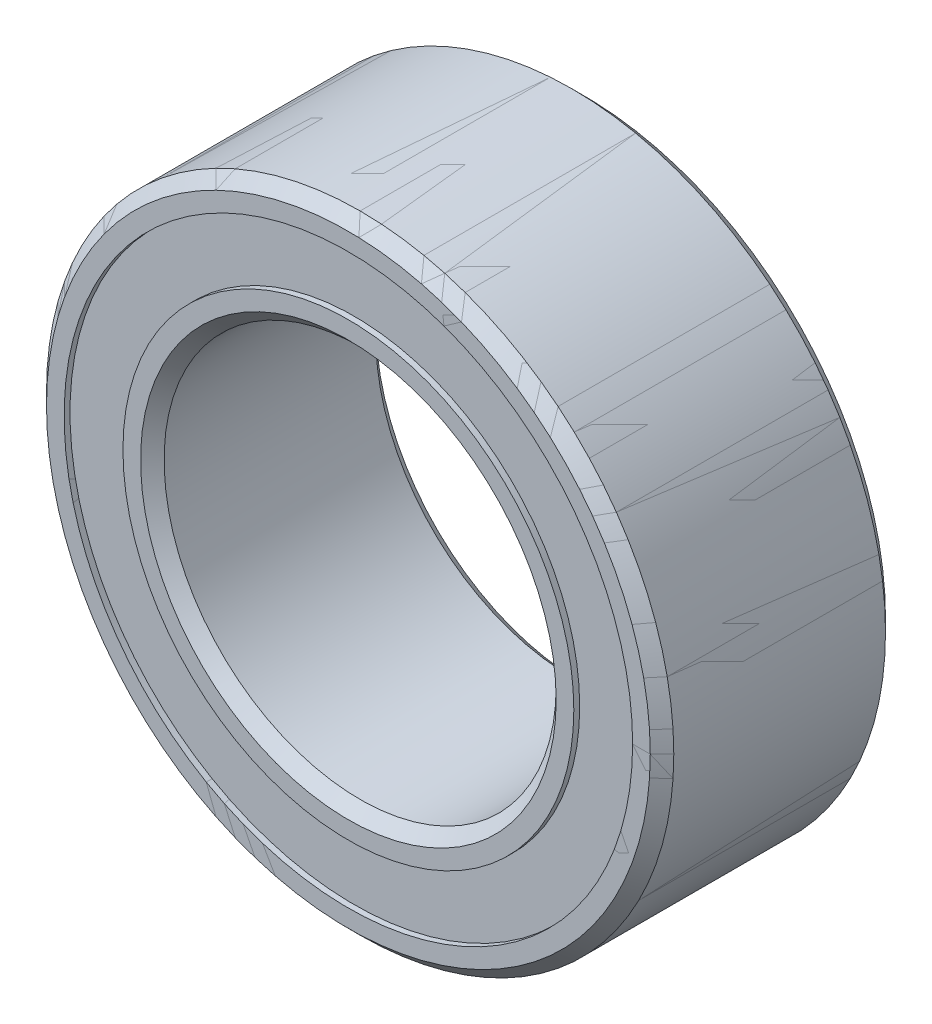
ISO-10303-21;
HEADER;
FILE_DESCRIPTION(('STEP AP214'),'2;1');
FILE_NAME('part.step','',(''),(''),'','','');
FILE_SCHEMA(('AUTOMOTIVE_DESIGN { 1 0 10303 214 1 1 1 1 }'));
ENDSEC;
DATA;
#1=APPLICATION_CONTEXT('core data for automotive mechanical design processes');
#2=APPLICATION_PROTOCOL_DEFINITION('international standard','automotive_design',2000,#1);
#3=PRODUCT_CONTEXT('',#1,'mechanical');
#4=PRODUCT('Part','Part','',(#3));
#5=PRODUCT_RELATED_PRODUCT_CATEGORY('part','',(#4));
#6=PRODUCT_DEFINITION_FORMATION('','',#4);
#7=PRODUCT_DEFINITION_CONTEXT('part definition',#1,'design');
#8=PRODUCT_DEFINITION('design','',#6,#7);
#9=PRODUCT_DEFINITION_SHAPE('','',#8);
#10=(LENGTH_UNIT() NAMED_UNIT(*) SI_UNIT(.MILLI.,.METRE.));
#11=(NAMED_UNIT(*) PLANE_ANGLE_UNIT() SI_UNIT($,.RADIAN.));
#12=(NAMED_UNIT(*) SI_UNIT($,.STERADIAN.) SOLID_ANGLE_UNIT());
#13=UNCERTAINTY_MEASURE_WITH_UNIT(LENGTH_MEASURE(1.E-05),#10,'distance_accuracy_value','');
#14=(GEOMETRIC_REPRESENTATION_CONTEXT(3) GLOBAL_UNCERTAINTY_ASSIGNED_CONTEXT((#13)) GLOBAL_UNIT_ASSIGNED_CONTEXT((#10,
#11,#12)) REPRESENTATION_CONTEXT('',''));
#15=CARTESIAN_POINT('',(0.,0.,0.));
#16=DIRECTION('',(0.,0.,1.));
#17=DIRECTION('',(1.,0.,0.));
#18=AXIS2_PLACEMENT_3D('',#15,#16,#17);
#19=CARTESIAN_POINT('',(0.,0.,1.5));
#20=DIRECTION('',(0.,0.,1.));
#21=DIRECTION('',(1.,0.,0.));
#22=AXIS2_PLACEMENT_3D('',#19,#20,#21);
#23=CYLINDRICAL_SURFACE('',#22,3.625);
#24=CARTESIAN_POINT('',(0.,0.,-0.499999999999999));
#25=DIRECTION('',(0.,0.,1.));
#26=DIRECTION('',(1.,0.,0.));
#27=AXIS2_PLACEMENT_3D('',#24,#25,#26);
#28=CIRCLE('',#27,3.625);
#29=CARTESIAN_POINT('',(3.625,0.,-0.499999999999999));
#30=VERTEX_POINT('',#29);
#31=EDGE_CURVE('E11',#30,#30,#28,.T.);
#32=ORIENTED_EDGE('',*,*,#31,.F.);
#33=EDGE_LOOP('',(#32));
#34=FACE_BOUND('',#33,.T.);
#35=CARTESIAN_POINT('',(0.,0.,-1.425));
#36=DIRECTION('',(0.,0.,1.));
#37=DIRECTION('',(1.,0.,0.));
#38=AXIS2_PLACEMENT_3D('',#35,#36,#37);
#39=CIRCLE('',#38,3.625);
#40=CARTESIAN_POINT('',(3.625,0.,-1.425));
#41=VERTEX_POINT('',#40);
#42=EDGE_CURVE('E60',#41,#41,#39,.T.);
#43=ORIENTED_EDGE('',*,*,#42,.T.);
#44=EDGE_LOOP('',(#43));
#45=FACE_BOUND('',#44,.T.);
#46=ADVANCED_FACE('F46',(#34,#45),#23,.T.);
#47=CARTESIAN_POINT('',(0.,3.625,-0.499999999999999));
#48=DIRECTION('',(0.,0.,-1.));
#49=DIRECTION('',(-1.,0.,0.));
#50=AXIS2_PLACEMENT_3D('',#47,#48,#49);
#51=PLANE('',#50);
#52=CARTESIAN_POINT('',(0.,0.,-0.499999999999999));
#53=DIRECTION('',(0.,0.,1.));
#54=DIRECTION('',(1.,0.,0.));
#55=AXIS2_PLACEMENT_3D('',#52,#53,#54);
#56=CIRCLE('',#55,2.875);
#57=CARTESIAN_POINT('',(2.875,0.,-0.499999999999999));
#58=VERTEX_POINT('',#57);
#59=EDGE_CURVE('E52',#58,#58,#56,.T.);
#60=ORIENTED_EDGE('',*,*,#59,.F.);
#61=EDGE_LOOP('',(#60));
#62=FACE_BOUND('',#61,.T.);
#63=ORIENTED_EDGE('',*,*,#31,.T.);
#64=EDGE_LOOP('',(#63));
#65=FACE_BOUND('',#64,.T.);
#66=ADVANCED_FACE('F75',(#62,#65),#51,.F.);
#67=CARTESIAN_POINT('',(0.,0.,1.5));
#68=DIRECTION('',(0.,0.,1.));
#69=DIRECTION('',(1.,0.,0.));
#70=AXIS2_PLACEMENT_3D('',#67,#68,#69);
#71=CYLINDRICAL_SURFACE('',#70,2.875);
#72=CARTESIAN_POINT('',(0.,0.,-1.425));
#73=DIRECTION('',(0.,0.,1.));
#74=DIRECTION('',(1.,0.,0.));
#75=AXIS2_PLACEMENT_3D('',#72,#73,#74);
#76=CIRCLE('',#75,2.875);
#77=CARTESIAN_POINT('',(2.875,0.,-1.425));
#78=VERTEX_POINT('',#77);
#79=EDGE_CURVE('E56',#78,#78,#76,.T.);
#80=ORIENTED_EDGE('',*,*,#79,.F.);
#81=EDGE_LOOP('',(#80));
#82=FACE_BOUND('',#81,.T.);
#83=ORIENTED_EDGE('',*,*,#59,.T.);
#84=EDGE_LOOP('',(#83));
#85=FACE_BOUND('',#84,.T.);
#86=ADVANCED_FACE('F70',(#82,#85),#71,.F.);
#87=CARTESIAN_POINT('',(0.,3.625,-1.425));
#88=DIRECTION('',(0.,0.,1.));
#89=DIRECTION('',(1.,0.,0.));
#90=AXIS2_PLACEMENT_3D('',#87,#88,#89);
#91=PLANE('',#90);
#92=ORIENTED_EDGE('',*,*,#42,.F.);
#93=EDGE_LOOP('',(#92));
#94=FACE_BOUND('',#93,.T.);
#95=ORIENTED_EDGE('',*,*,#79,.T.);
#96=EDGE_LOOP('',(#95));
#97=FACE_BOUND('',#96,.T.);
#98=ADVANCED_FACE('F67',(#94,#97),#91,.F.);
#99=CLOSED_SHELL('',(#46,#66,#86,#98));
#100=MANIFOLD_SOLID_BREP('B2',#99);
#101=CARTESIAN_POINT('',(0.,3.625,1.425));
#102=DIRECTION('',(0.,0.,-1.));
#103=DIRECTION('',(-1.,0.,0.));
#104=AXIS2_PLACEMENT_3D('',#101,#102,#103);
#105=PLANE('',#104);
#106=CARTESIAN_POINT('',(0.,0.,1.425));
#107=DIRECTION('',(0.,0.,1.));
#108=DIRECTION('',(1.,0.,0.));
#109=AXIS2_PLACEMENT_3D('',#106,#107,#108);
#110=CIRCLE('',#109,2.875);
#111=CARTESIAN_POINT('',(2.875,0.,1.425));
#112=VERTEX_POINT('',#111);
#113=EDGE_CURVE('E45',#112,#112,#110,.T.);
#114=ORIENTED_EDGE('',*,*,#113,.F.);
#115=EDGE_LOOP('',(#114));
#116=FACE_BOUND('',#115,.T.);
#117=CARTESIAN_POINT('',(0.,0.,1.425));
#118=DIRECTION('',(0.,0.,1.));
#119=DIRECTION('',(1.,0.,0.));
#120=AXIS2_PLACEMENT_3D('',#117,#118,#119);
#121=CIRCLE('',#120,3.625);
#122=CARTESIAN_POINT('',(3.625,0.,1.425));
#123=VERTEX_POINT('',#122);
#124=EDGE_CURVE('E120',#123,#123,#121,.T.);
#125=ORIENTED_EDGE('',*,*,#124,.T.);
#126=EDGE_LOOP('',(#125));
#127=FACE_BOUND('',#126,.T.);
#128=ADVANCED_FACE('F106',(#116,#127),#105,.F.);
#129=CARTESIAN_POINT('',(0.,0.,1.5));
#130=DIRECTION('',(0.,0.,1.));
#131=DIRECTION('',(1.,0.,0.));
#132=AXIS2_PLACEMENT_3D('',#129,#130,#131);
#133=CYLINDRICAL_SURFACE('',#132,2.875);
#134=CARTESIAN_POINT('',(0.,0.,0.499999999999999));
#135=DIRECTION('',(0.,0.,1.));
#136=DIRECTION('',(1.,0.,0.));
#137=AXIS2_PLACEMENT_3D('',#134,#135,#136);
#138=CIRCLE('',#137,2.875);
#139=CARTESIAN_POINT('',(2.875,0.,0.499999999999999));
#140=VERTEX_POINT('',#139);
#141=EDGE_CURVE('E112',#140,#140,#138,.T.);
#142=ORIENTED_EDGE('',*,*,#141,.F.);
#143=EDGE_LOOP('',(#142));
#144=FACE_BOUND('',#143,.T.);
#145=ORIENTED_EDGE('',*,*,#113,.T.);
#146=EDGE_LOOP('',(#145));
#147=FACE_BOUND('',#146,.T.);
#148=ADVANCED_FACE('F135',(#144,#147),#133,.F.);
#149=CARTESIAN_POINT('',(0.,3.625,0.499999999999999));
#150=DIRECTION('',(0.,0.,1.));
#151=DIRECTION('',(1.,0.,0.));
#152=AXIS2_PLACEMENT_3D('',#149,#150,#151);
#153=PLANE('',#152);
#154=CARTESIAN_POINT('',(0.,0.,0.499999999999999));
#155=DIRECTION('',(0.,0.,1.));
#156=DIRECTION('',(1.,0.,0.));
#157=AXIS2_PLACEMENT_3D('',#154,#155,#156);
#158=CIRCLE('',#157,3.625);
#159=CARTESIAN_POINT('',(3.625,0.,0.499999999999999));
#160=VERTEX_POINT('',#159);
#161=EDGE_CURVE('E116',#160,#160,#158,.T.);
#162=ORIENTED_EDGE('',*,*,#161,.F.);
#163=EDGE_LOOP('',(#162));
#164=FACE_BOUND('',#163,.T.);
#165=ORIENTED_EDGE('',*,*,#141,.T.);
#166=EDGE_LOOP('',(#165));
#167=FACE_BOUND('',#166,.T.);
#168=ADVANCED_FACE('F130',(#164,#167),#153,.F.);
#169=CARTESIAN_POINT('',(0.,0.,1.5));
#170=DIRECTION('',(0.,0.,1.));
#171=DIRECTION('',(1.,0.,0.));
#172=AXIS2_PLACEMENT_3D('',#169,#170,#171);
#173=CYLINDRICAL_SURFACE('',#172,3.625);
#174=ORIENTED_EDGE('',*,*,#124,.F.);
#175=EDGE_LOOP('',(#174));
#176=FACE_BOUND('',#175,.T.);
#177=ORIENTED_EDGE('',*,*,#161,.T.);
#178=EDGE_LOOP('',(#177));
#179=FACE_BOUND('',#178,.T.);
#180=ADVANCED_FACE('F127',(#176,#179),#173,.T.);
#181=CLOSED_SHELL('',(#128,#148,#168,#180));
#182=MANIFOLD_SOLID_BREP('B6',#181);
#183=CARTESIAN_POINT('',(-1.75708265673066,2.73407398170136,0.));
#184=DIRECTION('',(0.,0.,1.));
#185=DIRECTION('',(-0.540640817455587,0.841253532831188,0.));
#186=AXIS2_PLACEMENT_3D('',#183,#184,#185);
#187=SPHERICAL_SURFACE('',#186,0.499999999999999);
#188=CARTESIAN_POINT('',(-1.75708265673066,2.73407398170136,0.499999999999999));
#189=VERTEX_POINT('',#188);
#190=VERTEX_LOOP('',#189);
#191=FACE_BOUND('',#190,.T.);
#192=ADVANCED_FACE('F166',(#191),#187,.T.);
#193=CLOSED_SHELL('',(#192));
#194=MANIFOLD_SOLID_BREP('B40',#193);
#195=CARTESIAN_POINT('',(-2.95630398490217,1.35009879225616,0.));
#196=DIRECTION('',(0.,0.,1.));
#197=DIRECTION('',(-0.909631995354514,0.415415013001897,0.));
#198=AXIS2_PLACEMENT_3D('',#195,#196,#197);
#199=SPHERICAL_SURFACE('',#198,0.499999999999999);
#200=CARTESIAN_POINT('',(-2.95630398490217,1.35009879225616,0.499999999999999));
#201=VERTEX_POINT('',#200);
#202=VERTEX_LOOP('',#201);
#203=FACE_BOUND('',#202,.T.);
#204=ADVANCED_FACE('F183',(#203),#199,.T.);
#205=CLOSED_SHELL('',(#204));
#206=MANIFOLD_SOLID_BREP('B102',#205);
#207=CARTESIAN_POINT('',(-3.21691968611304,-0.462523224388146,0.));
#208=DIRECTION('',(0.,0.,1.));
#209=DIRECTION('',(-0.989821441880934,-0.142314838273276,0.));
#210=AXIS2_PLACEMENT_3D('',#207,#208,#209);
#211=SPHERICAL_SURFACE('',#210,0.499999999999999);
#212=CARTESIAN_POINT('',(-3.21691968611304,-0.462523224388146,0.499999999999999));
#213=VERTEX_POINT('',#212);
#214=VERTEX_LOOP('',#213);
#215=FACE_BOUND('',#214,.T.);
#216=ADVANCED_FACE('F200',(#215),#211,.T.);
#217=CLOSED_SHELL('',(#216));
#218=MANIFOLD_SOLID_BREP('B162',#217);
#219=CARTESIAN_POINT('',(-2.45618611665136,-2.12829738532216,0.));
#220=DIRECTION('',(0.,0.,1.));
#221=DIRECTION('',(-0.755749574354264,-0.654860733945279,0.));
#222=AXIS2_PLACEMENT_3D('',#219,#220,#221);
#223=SPHERICAL_SURFACE('',#222,0.499999999999999);
#224=CARTESIAN_POINT('',(-2.45618611665136,-2.12829738532216,0.499999999999999));
#225=VERTEX_POINT('',#224);
#226=VERTEX_LOOP('',#225);
#227=FACE_BOUND('',#226,.T.);
#228=ADVANCED_FACE('F217',(#227),#223,.T.);
#229=CLOSED_SHELL('',(#228));
#230=MANIFOLD_SOLID_BREP('B179',#229);
#231=CARTESIAN_POINT('',(-0.915630809734669,-3.11835216424711,0.));
#232=DIRECTION('',(0.,0.,1.));
#233=DIRECTION('',(-0.281732556841437,-0.959492973614495,0.));
#234=AXIS2_PLACEMENT_3D('',#231,#232,#233);
#235=SPHERICAL_SURFACE('',#234,0.499999999999999);
#236=CARTESIAN_POINT('',(-0.915630809734669,-3.11835216424711,0.499999999999999));
#237=VERTEX_POINT('',#236);
#238=VERTEX_LOOP('',#237);
#239=FACE_BOUND('',#238,.T.);
#240=ADVANCED_FACE('F234',(#239),#235,.T.);
#241=CLOSED_SHELL('',(#240));
#242=MANIFOLD_SOLID_BREP('B196',#241);
#243=CARTESIAN_POINT('',(0.915630809734627,-3.11835216424712,0.));
#244=DIRECTION('',(0.,0.,1.));
#245=DIRECTION('',(0.281732556841424,-0.959492973614499,0.));
#246=AXIS2_PLACEMENT_3D('',#243,#244,#245);
#247=SPHERICAL_SURFACE('',#246,0.499999999999999);
#248=CARTESIAN_POINT('',(0.915630809734627,-3.11835216424712,0.499999999999999));
#249=VERTEX_POINT('',#248);
#250=VERTEX_LOOP('',#249);
#251=FACE_BOUND('',#250,.T.);
#252=ADVANCED_FACE('F251',(#251),#247,.T.);
#253=CLOSED_SHELL('',(#252));
#254=MANIFOLD_SOLID_BREP('B213',#253);
#255=CARTESIAN_POINT('',(2.45618611665133,-2.12829738532219,0.));
#256=DIRECTION('',(0.,0.,1.));
#257=DIRECTION('',(0.755749574354255,-0.654860733945289,0.));
#258=AXIS2_PLACEMENT_3D('',#255,#256,#257);
#259=SPHERICAL_SURFACE('',#258,0.499999999999999);
#260=CARTESIAN_POINT('',(2.45618611665133,-2.12829738532219,0.499999999999999));
#261=VERTEX_POINT('',#260);
#262=VERTEX_LOOP('',#261);
#263=FACE_BOUND('',#262,.T.);
#264=ADVANCED_FACE('F268',(#263),#259,.T.);
#265=CLOSED_SHELL('',(#264));
#266=MANIFOLD_SOLID_BREP('B230',#265);
#267=CARTESIAN_POINT('',(3.21691968611303,-0.462523224388188,0.));
#268=DIRECTION('',(0.,0.,1.));
#269=DIRECTION('',(0.989821441880932,-0.142314838273289,0.));
#270=AXIS2_PLACEMENT_3D('',#267,#268,#269);
#271=SPHERICAL_SURFACE('',#270,0.499999999999999);
#272=CARTESIAN_POINT('',(3.21691968611303,-0.462523224388188,0.499999999999999));
#273=VERTEX_POINT('',#272);
#274=VERTEX_LOOP('',#273);
#275=FACE_BOUND('',#274,.T.);
#276=ADVANCED_FACE('F285',(#275),#271,.T.);
#277=CLOSED_SHELL('',(#276));
#278=MANIFOLD_SOLID_BREP('B247',#277);
#279=CARTESIAN_POINT('',(2.95630398490219,1.35009879225612,0.));
#280=DIRECTION('',(0.,0.,1.));
#281=DIRECTION('',(0.90963199535452,0.415415013001884,0.));
#282=AXIS2_PLACEMENT_3D('',#279,#280,#281);
#283=SPHERICAL_SURFACE('',#282,0.499999999999999);
#284=CARTESIAN_POINT('',(2.95630398490219,1.35009879225612,0.499999999999999));
#285=VERTEX_POINT('',#284);
#286=VERTEX_LOOP('',#285);
#287=FACE_BOUND('',#286,.T.);
#288=ADVANCED_FACE('F302',(#287),#283,.T.);
#289=CLOSED_SHELL('',(#288));
#290=MANIFOLD_SOLID_BREP('B264',#289);
#291=CARTESIAN_POINT('',(1.7570826567307,2.73407398170134,0.));
#292=DIRECTION('',(0.,0.,1.));
#293=DIRECTION('',(0.540640817455599,0.841253532831181,0.));
#294=AXIS2_PLACEMENT_3D('',#291,#292,#293);
#295=SPHERICAL_SURFACE('',#294,0.499999999999999);
#296=CARTESIAN_POINT('',(1.7570826567307,2.73407398170134,0.499999999999999));
#297=VERTEX_POINT('',#296);
#298=VERTEX_LOOP('',#297);
#299=FACE_BOUND('',#298,.T.);
#300=ADVANCED_FACE('F319',(#299),#295,.T.);
#301=CLOSED_SHELL('',(#300));
#302=MANIFOLD_SOLID_BREP('B281',#301);
#303=CARTESIAN_POINT('',(0.,3.25,0.));
#304=DIRECTION('',(0.,0.,1.));
#305=DIRECTION('',(0.,1.,0.));
#306=AXIS2_PLACEMENT_3D('',#303,#304,#305);
#307=SPHERICAL_SURFACE('',#306,0.499999999999999);
#308=CARTESIAN_POINT('',(0.,3.25,0.499999999999999));
#309=VERTEX_POINT('',#308);
#310=VERTEX_LOOP('',#309);
#311=FACE_BOUND('',#310,.T.);
#312=ADVANCED_FACE('F338',(#311),#307,.T.);
#313=CLOSED_SHELL('',(#312));
#314=MANIFOLD_SOLID_BREP('B298',#313);
#315=CARTESIAN_POINT('',(0.,0.,0.));
#316=DIRECTION('',(0.,0.,1.));
#317=DIRECTION('',(1.,0.,0.));
#318=AXIS2_PLACEMENT_3D('',#315,#316,#317);
#319=TOROIDAL_SURFACE('',#318,3.25,0.5);
#320=CARTESIAN_POINT('',(0.,0.,0.330718913883074));
#321=DIRECTION('',(0.,0.,1.));
#322=DIRECTION('',(1.,0.,0.));
#323=AXIS2_PLACEMENT_3D('',#320,#321,#322);
#324=CIRCLE('',#323,2.875);
#325=CARTESIAN_POINT('',(2.875,0.,0.330718913883074));
#326=VERTEX_POINT('',#325);
#327=EDGE_CURVE('E385',#326,#326,#324,.T.);
#328=ORIENTED_EDGE('',*,*,#327,.F.);
#329=EDGE_LOOP('',(#328));
#330=FACE_BOUND('',#329,.T.);
#331=CARTESIAN_POINT('',(0.,0.,-0.330718913883074));
#332=DIRECTION('',(0.,0.,1.));
#333=DIRECTION('',(1.,0.,0.));
#334=AXIS2_PLACEMENT_3D('',#331,#332,#333);
#335=CIRCLE('',#334,2.875);
#336=CARTESIAN_POINT('',(2.875,0.,-0.330718913883074));
#337=VERTEX_POINT('',#336);
#338=EDGE_CURVE('E337',#337,#337,#335,.T.);
#339=ORIENTED_EDGE('',*,*,#338,.T.);
#340=EDGE_LOOP('',(#339));
#341=FACE_BOUND('',#340,.T.);
#342=ADVANCED_FACE('F357',(#330,#341),#319,.F.);
#343=CARTESIAN_POINT('',(0.,0.,1.5));
#344=DIRECTION('',(0.,0.,1.));
#345=DIRECTION('',(1.,0.,0.));
#346=AXIS2_PLACEMENT_3D('',#343,#344,#345);
#347=CYLINDRICAL_SURFACE('',#346,2.875);
#348=ORIENTED_EDGE('',*,*,#338,.F.);
#349=EDGE_LOOP('',(#348));
#350=FACE_BOUND('',#349,.T.);
#351=CARTESIAN_POINT('',(0.,0.,-1.5));
#352=DIRECTION('',(0.,0.,1.));
#353=DIRECTION('',(1.,0.,0.));
#354=AXIS2_PLACEMENT_3D('',#351,#352,#353);
#355=CIRCLE('',#354,2.875);
#356=CARTESIAN_POINT('',(2.875,0.,-1.5));
#357=VERTEX_POINT('',#356);
#358=EDGE_CURVE('E363',#357,#357,#355,.T.);
#359=ORIENTED_EDGE('',*,*,#358,.T.);
#360=EDGE_LOOP('',(#359));
#361=FACE_BOUND('',#360,.T.);
#362=ADVANCED_FACE('F392',(#350,#361),#347,.T.);
#363=CARTESIAN_POINT('',(0.,2.65,-1.5));
#364=DIRECTION('',(0.,0.,1.));
#365=DIRECTION('',(1.,0.,0.));
#366=AXIS2_PLACEMENT_3D('',#363,#364,#365);
#367=PLANE('',#366);
#368=ORIENTED_EDGE('',*,*,#358,.F.);
#369=EDGE_LOOP('',(#368));
#370=FACE_BOUND('',#369,.T.);
#371=CARTESIAN_POINT('',(0.,0.,-1.5));
#372=DIRECTION('',(0.,0.,1.));
#373=DIRECTION('',(1.,0.,0.));
#374=AXIS2_PLACEMENT_3D('',#371,#372,#373);
#375=CIRCLE('',#374,2.65);
#376=CARTESIAN_POINT('',(2.65,0.,-1.5));
#377=VERTEX_POINT('',#376);
#378=EDGE_CURVE('E367',#377,#377,#375,.T.);
#379=ORIENTED_EDGE('',*,*,#378,.T.);
#380=EDGE_LOOP('',(#379));
#381=FACE_BOUND('',#380,.T.);
#382=ADVANCED_FACE('F396',(#370,#381),#367,.F.);
#383=CARTESIAN_POINT('',(0.,0.,-1.35));
#384=DIRECTION('',(0.,0.,-1.));
#385=DIRECTION('',(-1.,0.,0.));
#386=AXIS2_PLACEMENT_3D('',#383,#384,#385);
#387=CONICAL_SURFACE('',#386,2.5,0.785398163397455);
#388=ORIENTED_EDGE('',*,*,#378,.F.);
#389=EDGE_LOOP('',(#388));
#390=FACE_BOUND('',#389,.T.);
#391=CARTESIAN_POINT('',(0.,0.,-1.35));
#392=DIRECTION('',(0.,0.,1.));
#393=DIRECTION('',(1.,0.,0.));
#394=AXIS2_PLACEMENT_3D('',#391,#392,#393);
#395=CIRCLE('',#394,2.5);
#396=CARTESIAN_POINT('',(2.5,0.,-1.35));
#397=VERTEX_POINT('',#396);
#398=EDGE_CURVE('E371',#397,#397,#395,.T.);
#399=ORIENTED_EDGE('',*,*,#398,.T.);
#400=EDGE_LOOP('',(#399));
#401=FACE_BOUND('',#400,.T.);
#402=ADVANCED_FACE('F401',(#390,#401),#387,.F.);
#403=CARTESIAN_POINT('',(0.,0.,1.5));
#404=DIRECTION('',(0.,0.,1.));
#405=DIRECTION('',(1.,0.,0.));
#406=AXIS2_PLACEMENT_3D('',#403,#404,#405);
#407=CYLINDRICAL_SURFACE('',#406,2.5);
#408=ORIENTED_EDGE('',*,*,#398,.F.);
#409=EDGE_LOOP('',(#408));
#410=FACE_BOUND('',#409,.T.);
#411=CARTESIAN_POINT('',(0.,0.,1.35));
#412=DIRECTION('',(0.,0.,1.));
#413=DIRECTION('',(1.,0.,0.));
#414=AXIS2_PLACEMENT_3D('',#411,#412,#413);
#415=CIRCLE('',#414,2.5);
#416=CARTESIAN_POINT('',(2.5,0.,1.35));
#417=VERTEX_POINT('',#416);
#418=EDGE_CURVE('E376',#417,#417,#415,.T.);
#419=ORIENTED_EDGE('',*,*,#418,.T.);
#420=EDGE_LOOP('',(#419));
#421=FACE_BOUND('',#420,.T.);
#422=ADVANCED_FACE('F407',(#410,#421),#407,.F.);
#423=CARTESIAN_POINT('',(0.,0.,1.5));
#424=DIRECTION('',(0.,0.,1.));
#425=DIRECTION('',(1.,0.,0.));
#426=AXIS2_PLACEMENT_3D('',#423,#424,#425);
#427=CONICAL_SURFACE('',#426,2.65,0.785398163397447);
#428=ORIENTED_EDGE('',*,*,#418,.F.);
#429=EDGE_LOOP('',(#428));
#430=FACE_BOUND('',#429,.T.);
#431=CARTESIAN_POINT('',(0.,0.,1.5));
#432=DIRECTION('',(0.,0.,1.));
#433=DIRECTION('',(1.,0.,0.));
#434=AXIS2_PLACEMENT_3D('',#431,#432,#433);
#435=CIRCLE('',#434,2.65);
#436=CARTESIAN_POINT('',(2.65,0.,1.5));
#437=VERTEX_POINT('',#436);
#438=EDGE_CURVE('E379',#437,#437,#435,.T.);
#439=ORIENTED_EDGE('',*,*,#438,.T.);
#440=EDGE_LOOP('',(#439));
#441=FACE_BOUND('',#440,.T.);
#442=ADVANCED_FACE('F411',(#430,#441),#427,.F.);
#443=CARTESIAN_POINT('',(0.,2.65,1.5));
#444=DIRECTION('',(0.,0.,-1.));
#445=DIRECTION('',(-1.,0.,0.));
#446=AXIS2_PLACEMENT_3D('',#443,#444,#445);
#447=PLANE('',#446);
#448=ORIENTED_EDGE('',*,*,#438,.F.);
#449=EDGE_LOOP('',(#448));
#450=FACE_BOUND('',#449,.T.);
#451=CARTESIAN_POINT('',(0.,0.,1.5));
#452=DIRECTION('',(0.,0.,1.));
#453=DIRECTION('',(1.,0.,0.));
#454=AXIS2_PLACEMENT_3D('',#451,#452,#453);
#455=CIRCLE('',#454,2.875);
#456=CARTESIAN_POINT('',(2.875,0.,1.5));
#457=VERTEX_POINT('',#456);
#458=EDGE_CURVE('E382',#457,#457,#455,.T.);
#459=ORIENTED_EDGE('',*,*,#458,.T.);
#460=EDGE_LOOP('',(#459));
#461=FACE_BOUND('',#460,.T.);
#462=ADVANCED_FACE('F415',(#450,#461),#447,.F.);
#463=CARTESIAN_POINT('',(0.,0.,1.5));
#464=DIRECTION('',(0.,0.,1.));
#465=DIRECTION('',(1.,0.,0.));
#466=AXIS2_PLACEMENT_3D('',#463,#464,#465);
#467=CYLINDRICAL_SURFACE('',#466,2.875);
#468=ORIENTED_EDGE('',*,*,#458,.F.);
#469=EDGE_LOOP('',(#468));
#470=FACE_BOUND('',#469,.T.);
#471=ORIENTED_EDGE('',*,*,#327,.T.);
#472=EDGE_LOOP('',(#471));
#473=FACE_BOUND('',#472,.T.);
#474=ADVANCED_FACE('F389',(#470,#473),#467,.T.);
#475=CLOSED_SHELL('',(#342,#362,#382,#402,#422,#442,#462,#474));
#476=MANIFOLD_SOLID_BREP('B315',#475);
#477=CARTESIAN_POINT('',(0.,0.,1.5));
#478=DIRECTION('',(0.,0.,1.));
#479=DIRECTION('',(1.,0.,0.));
#480=AXIS2_PLACEMENT_3D('',#477,#478,#479);
#481=CYLINDRICAL_SURFACE('',#480,4.);
#482=CARTESIAN_POINT('',(0.,0.,1.35));
#483=DIRECTION('',(0.,0.,1.));
#484=DIRECTION('',(1.,0.,0.));
#485=AXIS2_PLACEMENT_3D('',#482,#483,#484);
#486=CIRCLE('',#485,4.);
#487=CARTESIAN_POINT('',(4.,0.,1.35));
#488=VERTEX_POINT('',#487);
#489=EDGE_CURVE('E356',#488,#488,#486,.T.);
#490=ORIENTED_EDGE('',*,*,#489,.F.);
#491=EDGE_LOOP('',(#490));
#492=FACE_BOUND('',#491,.T.);
#493=CARTESIAN_POINT('',(0.,0.,-1.35));
#494=DIRECTION('',(0.,0.,1.));
#495=DIRECTION('',(1.,0.,0.));
#496=AXIS2_PLACEMENT_3D('',#493,#494,#495);
#497=CIRCLE('',#496,4.);
#498=CARTESIAN_POINT('',(4.,0.,-1.35));
#499=VERTEX_POINT('',#498);
#500=EDGE_CURVE('E498',#499,#499,#497,.T.);
#501=ORIENTED_EDGE('',*,*,#500,.T.);
#502=EDGE_LOOP('',(#501));
#503=FACE_BOUND('',#502,.T.);
#504=ADVANCED_FACE('F470',(#492,#503),#481,.T.);
#505=CARTESIAN_POINT('',(0.,0.,1.35));
#506=DIRECTION('',(0.,0.,-1.));
#507=DIRECTION('',(-1.,0.,0.));
#508=AXIS2_PLACEMENT_3D('',#505,#506,#507);
#509=CONICAL_SURFACE('',#508,4.,0.785398163397446);
#510=CARTESIAN_POINT('',(0.,0.,1.5));
#511=DIRECTION('',(0.,0.,1.));
#512=DIRECTION('',(1.,0.,0.));
#513=AXIS2_PLACEMENT_3D('',#510,#511,#512);
#514=CIRCLE('',#513,3.85);
#515=CARTESIAN_POINT('',(3.85,0.,1.5));
#516=VERTEX_POINT('',#515);
#517=EDGE_CURVE('E476',#516,#516,#514,.T.);
#518=ORIENTED_EDGE('',*,*,#517,.F.);
#519=EDGE_LOOP('',(#518));
#520=FACE_BOUND('',#519,.T.);
#521=ORIENTED_EDGE('',*,*,#489,.T.);
#522=EDGE_LOOP('',(#521));
#523=FACE_BOUND('',#522,.T.);
#524=ADVANCED_FACE('F535',(#520,#523),#509,.T.);
#525=CARTESIAN_POINT('',(0.,3.85,1.5));
#526=DIRECTION('',(0.,0.,-1.));
#527=DIRECTION('',(-1.,0.,0.));
#528=AXIS2_PLACEMENT_3D('',#525,#526,#527);
#529=PLANE('',#528);
#530=CARTESIAN_POINT('',(0.,0.,1.5));
#531=DIRECTION('',(0.,0.,1.));
#532=DIRECTION('',(1.,0.,0.));
#533=AXIS2_PLACEMENT_3D('',#530,#531,#532);
#534=CIRCLE('',#533,3.625);
#535=CARTESIAN_POINT('',(3.625,0.,1.5));
#536=VERTEX_POINT('',#535);
#537=EDGE_CURVE('E480',#536,#536,#534,.T.);
#538=ORIENTED_EDGE('',*,*,#537,.F.);
#539=EDGE_LOOP('',(#538));
#540=FACE_BOUND('',#539,.T.);
#541=ORIENTED_EDGE('',*,*,#517,.T.);
#542=EDGE_LOOP('',(#541));
#543=FACE_BOUND('',#542,.T.);
#544=ADVANCED_FACE('F530',(#540,#543),#529,.F.);
#545=CARTESIAN_POINT('',(0.,0.,1.5));
#546=DIRECTION('',(0.,0.,1.));
#547=DIRECTION('',(1.,0.,0.));
#548=AXIS2_PLACEMENT_3D('',#545,#546,#547);
#549=CYLINDRICAL_SURFACE('',#548,3.625);
#550=CARTESIAN_POINT('',(0.,0.,0.330718913883074));
#551=DIRECTION('',(0.,0.,1.));
#552=DIRECTION('',(1.,0.,0.));
#553=AXIS2_PLACEMENT_3D('',#550,#551,#552);
#554=CIRCLE('',#553,3.625);
#555=CARTESIAN_POINT('',(3.625,0.,0.330718913883074));
#556=VERTEX_POINT('',#555);
#557=EDGE_CURVE('E484',#556,#556,#554,.T.);
#558=ORIENTED_EDGE('',*,*,#557,.F.);
#559=EDGE_LOOP('',(#558));
#560=FACE_BOUND('',#559,.T.);
#561=ORIENTED_EDGE('',*,*,#537,.T.);
#562=EDGE_LOOP('',(#561));
#563=FACE_BOUND('',#562,.T.);
#564=ADVANCED_FACE('F524',(#560,#563),#549,.F.);
#565=CARTESIAN_POINT('',(0.,0.,0.));
#566=DIRECTION('',(0.,0.,1.));
#567=DIRECTION('',(1.,0.,0.));
#568=AXIS2_PLACEMENT_3D('',#565,#566,#567);
#569=TOROIDAL_SURFACE('',#568,3.25,0.5);
#570=CARTESIAN_POINT('',(0.,0.,-0.330718913883075));
#571=DIRECTION('',(0.,0.,1.));
#572=DIRECTION('',(1.,0.,0.));
#573=AXIS2_PLACEMENT_3D('',#570,#571,#572);
#574=CIRCLE('',#573,3.625);
#575=CARTESIAN_POINT('',(3.625,0.,-0.330718913883075));
#576=VERTEX_POINT('',#575);
#577=EDGE_CURVE('E489',#576,#576,#574,.T.);
#578=ORIENTED_EDGE('',*,*,#577,.F.);
#579=EDGE_LOOP('',(#578));
#580=FACE_BOUND('',#579,.T.);
#581=ORIENTED_EDGE('',*,*,#557,.T.);
#582=EDGE_LOOP('',(#581));
#583=FACE_BOUND('',#582,.T.);
#584=ADVANCED_FACE('F518',(#580,#583),#569,.F.);
#585=CARTESIAN_POINT('',(0.,0.,1.5));
#586=DIRECTION('',(0.,0.,1.));
#587=DIRECTION('',(1.,0.,0.));
#588=AXIS2_PLACEMENT_3D('',#585,#586,#587);
#589=CYLINDRICAL_SURFACE('',#588,3.625);
#590=CARTESIAN_POINT('',(0.,0.,-1.5));
#591=DIRECTION('',(0.,0.,1.));
#592=DIRECTION('',(1.,0.,0.));
#593=AXIS2_PLACEMENT_3D('',#590,#591,#592);
#594=CIRCLE('',#593,3.625);
#595=CARTESIAN_POINT('',(3.625,0.,-1.5));
#596=VERTEX_POINT('',#595);
#597=EDGE_CURVE('E492',#596,#596,#594,.T.);
#598=ORIENTED_EDGE('',*,*,#597,.F.);
#599=EDGE_LOOP('',(#598));
#600=FACE_BOUND('',#599,.T.);
#601=ORIENTED_EDGE('',*,*,#577,.T.);
#602=EDGE_LOOP('',(#601));
#603=FACE_BOUND('',#602,.T.);
#604=ADVANCED_FACE('F512',(#600,#603),#589,.F.);
#605=CARTESIAN_POINT('',(0.,3.85,-1.5));
#606=DIRECTION('',(0.,0.,1.));
#607=DIRECTION('',(1.,0.,0.));
#608=AXIS2_PLACEMENT_3D('',#605,#606,#607);
#609=PLANE('',#608);
#610=CARTESIAN_POINT('',(0.,0.,-1.5));
#611=DIRECTION('',(0.,0.,1.));
#612=DIRECTION('',(1.,0.,0.));
#613=AXIS2_PLACEMENT_3D('',#610,#611,#612);
#614=CIRCLE('',#613,3.85);
#615=CARTESIAN_POINT('',(3.85,0.,-1.5));
#616=VERTEX_POINT('',#615);
#617=EDGE_CURVE('E495',#616,#616,#614,.T.);
#618=ORIENTED_EDGE('',*,*,#617,.F.);
#619=EDGE_LOOP('',(#618));
#620=FACE_BOUND('',#619,.T.);
#621=ORIENTED_EDGE('',*,*,#597,.T.);
#622=EDGE_LOOP('',(#621));
#623=FACE_BOUND('',#622,.T.);
#624=ADVANCED_FACE('F506',(#620,#623),#609,.F.);
#625=CARTESIAN_POINT('',(0.,0.,-1.5));
#626=DIRECTION('',(0.,0.,1.));
#627=DIRECTION('',(1.,0.,0.));
#628=AXIS2_PLACEMENT_3D('',#625,#626,#627);
#629=CONICAL_SURFACE('',#628,3.85,0.785398163397455);
#630=ORIENTED_EDGE('',*,*,#500,.F.);
#631=EDGE_LOOP('',(#630));
#632=FACE_BOUND('',#631,.T.);
#633=ORIENTED_EDGE('',*,*,#617,.T.);
#634=EDGE_LOOP('',(#633));
#635=FACE_BOUND('',#634,.T.);
#636=ADVANCED_FACE('F503',(#632,#635),#629,.T.);
#637=CLOSED_SHELL('',(#504,#524,#544,#564,#584,#604,#624,#636));
#638=MANIFOLD_SOLID_BREP('B332',#637);
#639=CARTESIAN_POINT('',(0.,4.,-1.5));
#640=DIRECTION('',(0.,0.,1.));
#641=DIRECTION('',(1.,0.,0.));
#642=AXIS2_PLACEMENT_3D('',#639,#640,#641);
#643=PLANE('',#642);
#644=CARTESIAN_POINT('',(0.,0.,-1.5));
#645=DIRECTION('',(0.,0.,1.));
#646=DIRECTION('',(1.,0.,0.));
#647=AXIS2_PLACEMENT_3D('',#644,#645,#646);
#648=CIRCLE('',#647,3.85);
#649=CARTESIAN_POINT('',(3.85,0.,-1.5));
#650=VERTEX_POINT('',#649);
#651=EDGE_CURVE('E583',#650,#650,#648,.F.);
#652=ORIENTED_EDGE('',*,*,#651,.T.);
#653=EDGE_LOOP('',(#652));
#654=FACE_BOUND('',#653,.T.);
#655=CARTESIAN_POINT('',(0.,0.,-1.5));
#656=DIRECTION('',(0.,0.,1.));
#657=DIRECTION('',(1.,0.,0.));
#658=AXIS2_PLACEMENT_3D('',#655,#656,#657);
#659=CIRCLE('',#658,3.625);
#660=CARTESIAN_POINT('',(3.625,0.,-1.5));
#661=VERTEX_POINT('',#660);
#662=EDGE_CURVE('E605',#661,#661,#659,.T.);
#663=ORIENTED_EDGE('',*,*,#662,.T.);
#664=EDGE_LOOP('',(#663));
#665=FACE_BOUND('',#664,.T.);
#666=ADVANCED_FACE('F576',(#654,#665),#643,.F.);
#667=CARTESIAN_POINT('',(0.,0.,1.5));
#668=DIRECTION('',(0.,0.,1.));
#669=DIRECTION('',(1.,0.,0.));
#670=AXIS2_PLACEMENT_3D('',#667,#668,#669);
#671=CYLINDRICAL_SURFACE('',#670,4.);
#672=CARTESIAN_POINT('',(0.,0.,-1.35));
#673=DIRECTION('',(0.,0.,1.));
#674=DIRECTION('',(1.,0.,0.));
#675=AXIS2_PLACEMENT_3D('',#672,#673,#674);
#676=CIRCLE('',#675,4.);
#677=CARTESIAN_POINT('',(4.,0.,-1.35));
#678=VERTEX_POINT('',#677);
#679=EDGE_CURVE('E587',#678,#678,#676,.T.);
#680=ORIENTED_EDGE('',*,*,#679,.T.);
#681=EDGE_LOOP('',(#680));
#682=FACE_BOUND('',#681,.T.);
#683=CARTESIAN_POINT('',(0.,0.,1.35));
#684=DIRECTION('',(0.,0.,-1.));
#685=DIRECTION('',(-1.,0.,0.));
#686=AXIS2_PLACEMENT_3D('',#683,#684,#685);
#687=CIRCLE('',#686,4.);
#688=CARTESIAN_POINT('',(-4.,0.,1.35));
#689=VERTEX_POINT('',#688);
#690=EDGE_CURVE('E591',#689,#689,#687,.T.);
#691=ORIENTED_EDGE('',*,*,#690,.T.);
#692=EDGE_LOOP('',(#691));
#693=FACE_BOUND('',#692,.T.);
#694=ADVANCED_FACE('F631',(#682,#693),#671,.T.);
#695=CARTESIAN_POINT('',(0.,4.,1.5));
#696=DIRECTION('',(0.,0.,-1.));
#697=DIRECTION('',(-1.,0.,0.));
#698=AXIS2_PLACEMENT_3D('',#695,#696,#697);
#699=PLANE('',#698);
#700=CARTESIAN_POINT('',(0.,0.,1.5));
#701=DIRECTION('',(0.,0.,-1.));
#702=DIRECTION('',(-1.,0.,0.));
#703=AXIS2_PLACEMENT_3D('',#700,#701,#702);
#704=CIRCLE('',#703,3.85);
#705=CARTESIAN_POINT('',(-3.85,0.,1.5));
#706=VERTEX_POINT('',#705);
#707=EDGE_CURVE('E469',#706,#706,#704,.F.);
#708=ORIENTED_EDGE('',*,*,#707,.T.);
#709=EDGE_LOOP('',(#708));
#710=FACE_BOUND('',#709,.T.);
#711=CARTESIAN_POINT('',(0.,0.,1.5));
#712=DIRECTION('',(0.,0.,1.));
#713=DIRECTION('',(1.,0.,0.));
#714=AXIS2_PLACEMENT_3D('',#711,#712,#713);
#715=CIRCLE('',#714,3.625);
#716=CARTESIAN_POINT('',(3.625,0.,1.5));
#717=VERTEX_POINT('',#716);
#718=EDGE_CURVE('E596',#717,#717,#715,.T.);
#719=ORIENTED_EDGE('',*,*,#718,.F.);
#720=EDGE_LOOP('',(#719));
#721=FACE_BOUND('',#720,.T.);
#722=ADVANCED_FACE('F626',(#710,#721),#699,.F.);
#723=CARTESIAN_POINT('',(0.,0.,1.5));
#724=DIRECTION('',(0.,0.,1.));
#725=DIRECTION('',(1.,0.,0.));
#726=AXIS2_PLACEMENT_3D('',#723,#724,#725);
#727=CYLINDRICAL_SURFACE('',#726,3.625);
#728=CARTESIAN_POINT('',(0.,0.,0.330718913883074));
#729=DIRECTION('',(0.,0.,1.));
#730=DIRECTION('',(1.,0.,0.));
#731=AXIS2_PLACEMENT_3D('',#728,#729,#730);
#732=CIRCLE('',#731,3.625);
#733=CARTESIAN_POINT('',(3.625,0.,0.330718913883074));
#734=VERTEX_POINT('',#733);
#735=EDGE_CURVE('E599',#734,#734,#732,.T.);
#736=ORIENTED_EDGE('',*,*,#735,.F.);
#737=EDGE_LOOP('',(#736));
#738=FACE_BOUND('',#737,.T.);
#739=ORIENTED_EDGE('',*,*,#718,.T.);
#740=EDGE_LOOP('',(#739));
#741=FACE_BOUND('',#740,.T.);
#742=ADVANCED_FACE('F620',(#738,#741),#727,.F.);
#743=CARTESIAN_POINT('',(0.,0.,0.));
#744=DIRECTION('',(0.,0.,1.));
#745=DIRECTION('',(1.,0.,0.));
#746=AXIS2_PLACEMENT_3D('',#743,#744,#745);
#747=TOROIDAL_SURFACE('',#746,3.25,0.5);
#748=CARTESIAN_POINT('',(0.,0.,-0.330718913883074));
#749=DIRECTION('',(0.,0.,1.));
#750=DIRECTION('',(1.,0.,0.));
#751=AXIS2_PLACEMENT_3D('',#748,#749,#750);
#752=CIRCLE('',#751,3.625);
#753=CARTESIAN_POINT('',(3.625,0.,-0.330718913883074));
#754=VERTEX_POINT('',#753);
#755=EDGE_CURVE('E602',#754,#754,#752,.T.);
#756=ORIENTED_EDGE('',*,*,#755,.F.);
#757=EDGE_LOOP('',(#756));
#758=FACE_BOUND('',#757,.T.);
#759=ORIENTED_EDGE('',*,*,#735,.T.);
#760=EDGE_LOOP('',(#759));
#761=FACE_BOUND('',#760,.T.);
#762=ADVANCED_FACE('F614',(#758,#761),#747,.F.);
#763=CARTESIAN_POINT('',(0.,0.,1.5));
#764=DIRECTION('',(0.,0.,1.));
#765=DIRECTION('',(1.,0.,0.));
#766=AXIS2_PLACEMENT_3D('',#763,#764,#765);
#767=CYLINDRICAL_SURFACE('',#766,3.625);
#768=ORIENTED_EDGE('',*,*,#662,.F.);
#769=EDGE_LOOP('',(#768));
#770=FACE_BOUND('',#769,.T.);
#771=ORIENTED_EDGE('',*,*,#755,.T.);
#772=EDGE_LOOP('',(#771));
#773=FACE_BOUND('',#772,.T.);
#774=ADVANCED_FACE('F610',(#770,#773),#767,.F.);
#775=CARTESIAN_POINT('',(0.,0.,-1.35));
#776=DIRECTION('',(0.,0.,1.));
#777=DIRECTION('',(1.,0.,0.));
#778=AXIS2_PLACEMENT_3D('',#775,#776,#777);
#779=CONICAL_SURFACE('',#778,4.,0.785398163397454);
#780=ORIENTED_EDGE('',*,*,#651,.F.);
#781=EDGE_LOOP('',(#780));
#782=FACE_BOUND('',#781,.T.);
#783=ORIENTED_EDGE('',*,*,#679,.F.);
#784=EDGE_LOOP('',(#783));
#785=FACE_BOUND('',#784,.T.);
#786=ADVANCED_FACE('F613',(#782,#785),#779,.T.);
#787=CARTESIAN_POINT('',(0.,0.,1.5));
#788=DIRECTION('',(0.,0.,-1.));
#789=DIRECTION('',(-1.,0.,0.));
#790=AXIS2_PLACEMENT_3D('',#787,#788,#789);
#791=CONICAL_SURFACE('',#790,3.85,0.785398163397445);
#792=ORIENTED_EDGE('',*,*,#690,.F.);
#793=EDGE_LOOP('',(#792));
#794=FACE_BOUND('',#793,.T.);
#795=ORIENTED_EDGE('',*,*,#707,.F.);
#796=EDGE_LOOP('',(#795));
#797=FACE_BOUND('',#796,.T.);
#798=ADVANCED_FACE('F578',(#794,#797),#791,.T.);
#799=CLOSED_SHELL('',(#666,#694,#722,#742,#762,#774,#786,#798));
#800=MANIFOLD_SOLID_BREP('B351',#799);
#801=ADVANCED_BREP_SHAPE_REPRESENTATION('',(#18,#100,#182,#194,#206,#218,#230,#242,#254,#266,
#278,#290,#302,#314,#476,#638,#800),#14);
#802=SHAPE_DEFINITION_REPRESENTATION(#9,#801);
ENDSEC;
END-ISO-10303-21;
